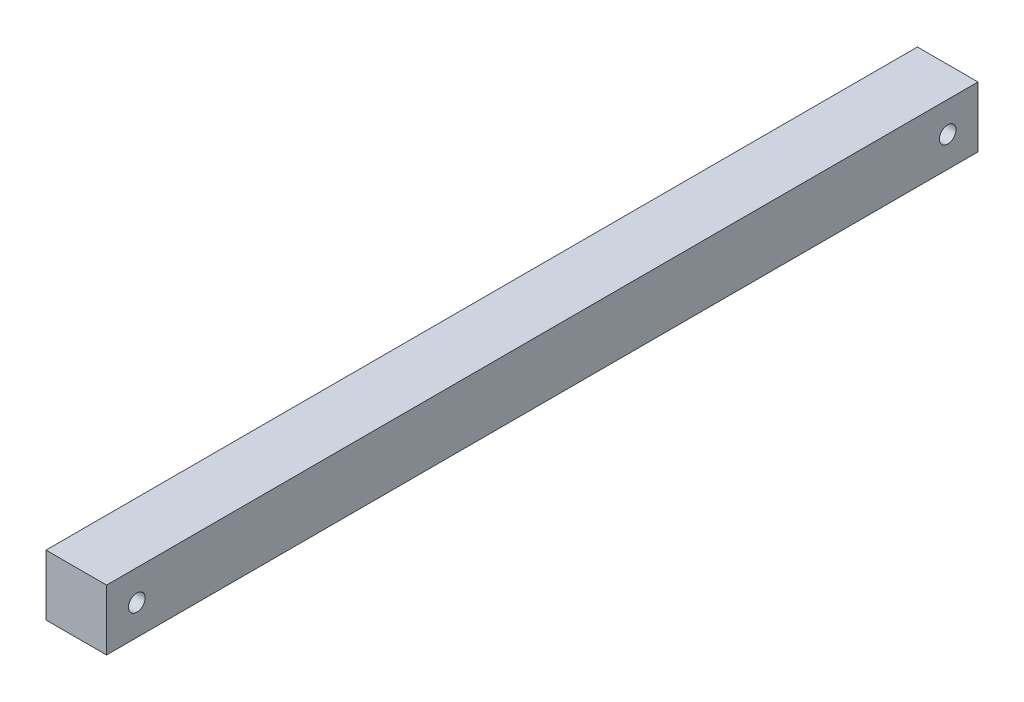
ISO-10303-21;
HEADER;
FILE_DESCRIPTION(('STEP AP214'),'2;1');
FILE_NAME('part.step','',(''),(''),'','','');
FILE_SCHEMA(('AUTOMOTIVE_DESIGN { 1 0 10303 214 1 1 1 1 }'));
ENDSEC;
DATA;
#1=APPLICATION_CONTEXT('core data for automotive mechanical design processes');
#2=APPLICATION_PROTOCOL_DEFINITION('international standard','automotive_design',2000,#1);
#3=PRODUCT_CONTEXT('',#1,'mechanical');
#4=PRODUCT('Part','Part','',(#3));
#5=PRODUCT_RELATED_PRODUCT_CATEGORY('part','',(#4));
#6=PRODUCT_DEFINITION_FORMATION('','',#4);
#7=PRODUCT_DEFINITION_CONTEXT('part definition',#1,'design');
#8=PRODUCT_DEFINITION('design','',#6,#7);
#9=PRODUCT_DEFINITION_SHAPE('','',#8);
#10=(LENGTH_UNIT() NAMED_UNIT(*) SI_UNIT(.MILLI.,.METRE.));
#11=(NAMED_UNIT(*) PLANE_ANGLE_UNIT() SI_UNIT($,.RADIAN.));
#12=(NAMED_UNIT(*) SI_UNIT($,.STERADIAN.) SOLID_ANGLE_UNIT());
#13=UNCERTAINTY_MEASURE_WITH_UNIT(LENGTH_MEASURE(1.E-05),#10,'distance_accuracy_value','');
#14=(GEOMETRIC_REPRESENTATION_CONTEXT(3) GLOBAL_UNCERTAINTY_ASSIGNED_CONTEXT((#13)) GLOBAL_UNIT_ASSIGNED_CONTEXT((#10,
#11,#12)) REPRESENTATION_CONTEXT('',''));
#15=CARTESIAN_POINT('',(0.,0.,0.));
#16=DIRECTION('',(0.,0.,1.));
#17=DIRECTION('',(1.,0.,0.));
#18=AXIS2_PLACEMENT_3D('',#15,#16,#17);
#19=CARTESIAN_POINT('',(12.7,-12.7,365.4));
#20=DIRECTION('',(-1.,0.,0.));
#21=DIRECTION('',(0.,0.,1.));
#22=AXIS2_PLACEMENT_3D('',#19,#20,#21);
#23=PLANE('',#22);
#24=CARTESIAN_POINT('',(12.7,0.,352.7));
#25=DIRECTION('',(-1.,0.,0.));
#26=DIRECTION('',(0.,0.,1.));
#27=AXIS2_PLACEMENT_3D('',#24,#25,#26);
#28=CIRCLE('',#27,3.50000000000002);
#29=CARTESIAN_POINT('',(12.7,0.,356.2));
#30=VERTEX_POINT('',#29);
#31=EDGE_CURVE('E99',#30,#30,#28,.T.);
#32=ORIENTED_EDGE('',*,*,#31,.T.);
#33=EDGE_LOOP('',(#32));
#34=FACE_BOUND('',#33,.T.);
#35=CARTESIAN_POINT('',(12.7,0.,12.7));
#36=DIRECTION('',(-1.,0.,0.));
#37=DIRECTION('',(0.,0.,-1.));
#38=AXIS2_PLACEMENT_3D('',#35,#36,#37);
#39=CIRCLE('',#38,3.50000000000003);
#40=CARTESIAN_POINT('',(12.7,0.,9.19999999999996));
#41=VERTEX_POINT('',#40);
#42=EDGE_CURVE('E113',#41,#41,#39,.T.);
#43=ORIENTED_EDGE('',*,*,#42,.T.);
#44=EDGE_LOOP('',(#43));
#45=FACE_BOUND('',#44,.T.);
#46=DIRECTION('',(0.,1.,0.));
#47=VECTOR('',#46,1.);
#48=CARTESIAN_POINT('',(12.7,-12.7,0.));
#49=LINE('',#48,#47);
#50=CARTESIAN_POINT('',(12.7,-12.7,0.));
#51=VERTEX_POINT('',#50);
#52=CARTESIAN_POINT('',(12.7,12.7,0.));
#53=VERTEX_POINT('',#52);
#54=EDGE_CURVE('E96',#51,#53,#49,.T.);
#55=ORIENTED_EDGE('',*,*,#54,.T.);
#56=DIRECTION('',(0.,0.,-1.));
#57=VECTOR('',#56,1.);
#58=CARTESIAN_POINT('',(12.7,12.7,365.4));
#59=LINE('',#58,#57);
#60=CARTESIAN_POINT('',(12.7,12.7,365.4));
#61=VERTEX_POINT('',#60);
#62=EDGE_CURVE('E11',#61,#53,#59,.T.);
#63=ORIENTED_EDGE('',*,*,#62,.F.);
#64=DIRECTION('',(0.,1.,0.));
#65=VECTOR('',#64,1.);
#66=CARTESIAN_POINT('',(12.7,-12.7,365.4));
#67=LINE('',#66,#65);
#68=CARTESIAN_POINT('',(12.7,-12.7,365.4));
#69=VERTEX_POINT('',#68);
#70=EDGE_CURVE('E84',#69,#61,#67,.T.);
#71=ORIENTED_EDGE('',*,*,#70,.F.);
#72=DIRECTION('',(0.,0.,-1.));
#73=VECTOR('',#72,1.);
#74=CARTESIAN_POINT('',(12.7,-12.7,365.4));
#75=LINE('',#74,#73);
#76=EDGE_CURVE('E92',#69,#51,#75,.T.);
#77=ORIENTED_EDGE('',*,*,#76,.T.);
#78=EDGE_LOOP('',(#55,#63,#71,#77));
#79=FACE_BOUND('',#78,.T.);
#80=ADVANCED_FACE('F33',(#34,#45,#79),#23,.F.);
#81=CARTESIAN_POINT('',(-12.7,12.7,365.4));
#82=DIRECTION('',(0.,-1.,0.));
#83=DIRECTION('',(0.,0.,-1.));
#84=AXIS2_PLACEMENT_3D('',#81,#82,#83);
#85=PLANE('',#84);
#86=DIRECTION('',(-1.,0.,0.));
#87=VECTOR('',#86,1.);
#88=CARTESIAN_POINT('',(-12.7,12.7,0.));
#89=LINE('',#88,#87);
#90=CARTESIAN_POINT('',(-12.7,12.7,0.));
#91=VERTEX_POINT('',#90);
#92=EDGE_CURVE('E88',#53,#91,#89,.T.);
#93=ORIENTED_EDGE('',*,*,#92,.T.);
#94=DIRECTION('',(0.,0.,-1.));
#95=VECTOR('',#94,1.);
#96=CARTESIAN_POINT('',(-12.7,12.7,365.4));
#97=LINE('',#96,#95);
#98=CARTESIAN_POINT('',(-12.7,12.7,365.4));
#99=VERTEX_POINT('',#98);
#100=EDGE_CURVE('E41',#99,#91,#97,.T.);
#101=ORIENTED_EDGE('',*,*,#100,.F.);
#102=DIRECTION('',(-1.,0.,0.));
#103=VECTOR('',#102,1.);
#104=CARTESIAN_POINT('',(-12.7,12.7,365.4));
#105=LINE('',#104,#103);
#106=EDGE_CURVE('E79',#61,#99,#105,.T.);
#107=ORIENTED_EDGE('',*,*,#106,.F.);
#108=ORIENTED_EDGE('',*,*,#62,.T.);
#109=EDGE_LOOP('',(#93,#101,#107,#108));
#110=FACE_BOUND('',#109,.T.);
#111=ADVANCED_FACE('F87',(#110),#85,.F.);
#112=CARTESIAN_POINT('',(-12.7,-12.7,365.4));
#113=DIRECTION('',(1.,0.,0.));
#114=DIRECTION('',(0.,0.,-1.));
#115=AXIS2_PLACEMENT_3D('',#112,#113,#114);
#116=PLANE('',#115);
#117=CARTESIAN_POINT('',(-12.7,0.,352.7));
#118=DIRECTION('',(-1.,0.,0.));
#119=DIRECTION('',(0.,0.,1.));
#120=AXIS2_PLACEMENT_3D('',#117,#118,#119);
#121=CIRCLE('',#120,3.50000000000002);
#122=CARTESIAN_POINT('',(-12.7,0.,356.2));
#123=VERTEX_POINT('',#122);
#124=EDGE_CURVE('E116',#123,#123,#121,.T.);
#125=ORIENTED_EDGE('',*,*,#124,.F.);
#126=EDGE_LOOP('',(#125));
#127=FACE_BOUND('',#126,.T.);
#128=CARTESIAN_POINT('',(-12.7,0.,12.7));
#129=DIRECTION('',(-1.,0.,0.));
#130=DIRECTION('',(0.,0.,-1.));
#131=AXIS2_PLACEMENT_3D('',#128,#129,#130);
#132=CIRCLE('',#131,3.50000000000003);
#133=CARTESIAN_POINT('',(-12.7,0.,9.19999999999996));
#134=VERTEX_POINT('',#133);
#135=EDGE_CURVE('E110',#134,#134,#132,.T.);
#136=ORIENTED_EDGE('',*,*,#135,.F.);
#137=EDGE_LOOP('',(#136));
#138=FACE_BOUND('',#137,.T.);
#139=DIRECTION('',(0.,-1.,0.));
#140=VECTOR('',#139,1.);
#141=CARTESIAN_POINT('',(-12.7,-12.7,0.));
#142=LINE('',#141,#140);
#143=CARTESIAN_POINT('',(-12.7,-12.7,0.));
#144=VERTEX_POINT('',#143);
#145=EDGE_CURVE('E66',#91,#144,#142,.T.);
#146=ORIENTED_EDGE('',*,*,#145,.T.);
#147=DIRECTION('',(0.,0.,-1.));
#148=VECTOR('',#147,1.);
#149=CARTESIAN_POINT('',(-12.7,-12.7,365.4));
#150=LINE('',#149,#148);
#151=CARTESIAN_POINT('',(-12.7,-12.7,365.4));
#152=VERTEX_POINT('',#151);
#153=EDGE_CURVE('E89',#152,#144,#150,.T.);
#154=ORIENTED_EDGE('',*,*,#153,.F.);
#155=DIRECTION('',(0.,-1.,0.));
#156=VECTOR('',#155,1.);
#157=CARTESIAN_POINT('',(-12.7,-12.7,365.4));
#158=LINE('',#157,#156);
#159=EDGE_CURVE('E82',#99,#152,#158,.T.);
#160=ORIENTED_EDGE('',*,*,#159,.F.);
#161=ORIENTED_EDGE('',*,*,#100,.T.);
#162=EDGE_LOOP('',(#146,#154,#160,#161));
#163=FACE_BOUND('',#162,.T.);
#164=ADVANCED_FACE('F90',(#127,#138,#163),#116,.F.);
#165=CARTESIAN_POINT('',(-12.7,-12.7,365.4));
#166=DIRECTION('',(0.,1.,0.));
#167=DIRECTION('',(0.,0.,1.));
#168=AXIS2_PLACEMENT_3D('',#165,#166,#167);
#169=PLANE('',#168);
#170=DIRECTION('',(1.,0.,0.));
#171=VECTOR('',#170,1.);
#172=CARTESIAN_POINT('',(-12.7,-12.7,0.));
#173=LINE('',#172,#171);
#174=EDGE_CURVE('E72',#144,#51,#173,.T.);
#175=ORIENTED_EDGE('',*,*,#174,.T.);
#176=ORIENTED_EDGE('',*,*,#76,.F.);
#177=DIRECTION('',(1.,0.,0.));
#178=VECTOR('',#177,1.);
#179=CARTESIAN_POINT('',(-12.7,-12.7,365.4));
#180=LINE('',#179,#178);
#181=EDGE_CURVE('E49',#152,#69,#180,.T.);
#182=ORIENTED_EDGE('',*,*,#181,.F.);
#183=ORIENTED_EDGE('',*,*,#153,.T.);
#184=EDGE_LOOP('',(#175,#176,#182,#183));
#185=FACE_BOUND('',#184,.T.);
#186=ADVANCED_FACE('F104',(#185),#169,.F.);
#187=CARTESIAN_POINT('',(0.,0.,365.4));
#188=DIRECTION('',(0.,0.,-1.));
#189=DIRECTION('',(-1.,0.,0.));
#190=AXIS2_PLACEMENT_3D('',#187,#188,#189);
#191=PLANE('',#190);
#192=ORIENTED_EDGE('',*,*,#70,.T.);
#193=ORIENTED_EDGE('',*,*,#106,.T.);
#194=ORIENTED_EDGE('',*,*,#159,.T.);
#195=ORIENTED_EDGE('',*,*,#181,.T.);
#196=EDGE_LOOP('',(#192,#193,#194,#195));
#197=FACE_BOUND('',#196,.T.);
#198=ADVANCED_FACE('F80',(#197),#191,.F.);
#199=CARTESIAN_POINT('',(0.,0.,0.));
#200=DIRECTION('',(0.,0.,-1.));
#201=DIRECTION('',(-1.,0.,0.));
#202=AXIS2_PLACEMENT_3D('',#199,#200,#201);
#203=PLANE('',#202);
#204=ORIENTED_EDGE('',*,*,#54,.F.);
#205=ORIENTED_EDGE('',*,*,#174,.F.);
#206=ORIENTED_EDGE('',*,*,#145,.F.);
#207=ORIENTED_EDGE('',*,*,#92,.F.);
#208=EDGE_LOOP('',(#204,#205,#206,#207));
#209=FACE_BOUND('',#208,.T.);
#210=ADVANCED_FACE('F107',(#209),#203,.T.);
#211=CARTESIAN_POINT('',(12.7,0.,12.7));
#212=DIRECTION('',(-1.,0.,0.));
#213=DIRECTION('',(0.,0.,1.));
#214=AXIS2_PLACEMENT_3D('',#211,#212,#213);
#215=CYLINDRICAL_SURFACE('',#214,3.50000000000003);
#216=ORIENTED_EDGE('',*,*,#42,.F.);
#217=EDGE_LOOP('',(#216));
#218=FACE_BOUND('',#217,.T.);
#219=ORIENTED_EDGE('',*,*,#135,.T.);
#220=EDGE_LOOP('',(#219));
#221=FACE_BOUND('',#220,.T.);
#222=ADVANCED_FACE('F127',(#218,#221),#215,.F.);
#223=CARTESIAN_POINT('',(12.7,0.,352.7));
#224=DIRECTION('',(-1.,0.,0.));
#225=DIRECTION('',(0.,0.,1.));
#226=AXIS2_PLACEMENT_3D('',#223,#224,#225);
#227=CYLINDRICAL_SURFACE('',#226,3.50000000000002);
#228=ORIENTED_EDGE('',*,*,#31,.F.);
#229=EDGE_LOOP('',(#228));
#230=FACE_BOUND('',#229,.T.);
#231=ORIENTED_EDGE('',*,*,#124,.T.);
#232=EDGE_LOOP('',(#231));
#233=FACE_BOUND('',#232,.T.);
#234=ADVANCED_FACE('F124',(#230,#233),#227,.F.);
#235=CLOSED_SHELL('',(#80,#111,#164,#186,#198,#210,#222,#234));
#236=MANIFOLD_SOLID_BREP('B2',#235);
#237=ADVANCED_BREP_SHAPE_REPRESENTATION('',(#18,#236),#14);
#238=SHAPE_DEFINITION_REPRESENTATION(#9,#237);
ENDSEC;
END-ISO-10303-21;
